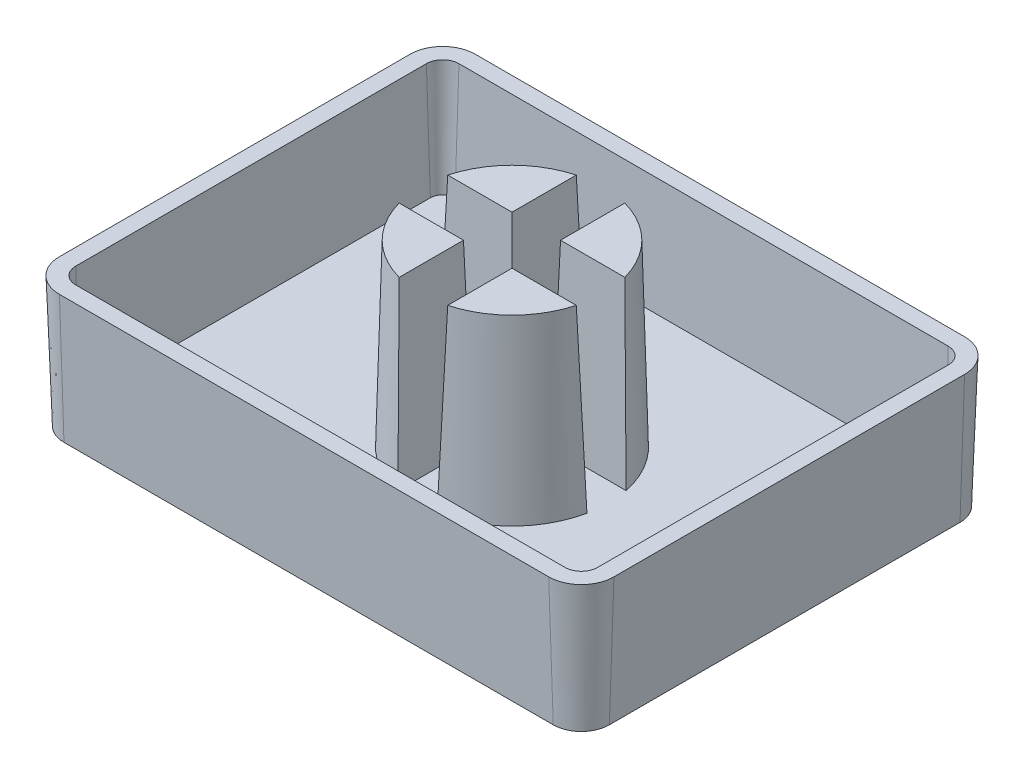
ISO-10303-21;
HEADER;
FILE_DESCRIPTION(('STEP AP214'),'2;1');
FILE_NAME('part.step','',(''),(''),'','','');
FILE_SCHEMA(('AUTOMOTIVE_DESIGN { 1 0 10303 214 1 1 1 1 }'));
ENDSEC;
DATA;
#1=APPLICATION_CONTEXT('core data for automotive mechanical design processes');
#2=APPLICATION_PROTOCOL_DEFINITION('international standard','automotive_design',2000,#1);
#3=PRODUCT_CONTEXT('',#1,'mechanical');
#4=PRODUCT('Part','Part','',(#3));
#5=PRODUCT_RELATED_PRODUCT_CATEGORY('part','',(#4));
#6=PRODUCT_DEFINITION_FORMATION('','',#4);
#7=PRODUCT_DEFINITION_CONTEXT('part definition',#1,'design');
#8=PRODUCT_DEFINITION('design','',#6,#7);
#9=PRODUCT_DEFINITION_SHAPE('','',#8);
#10=(LENGTH_UNIT() NAMED_UNIT(*) SI_UNIT(.MILLI.,.METRE.));
#11=(NAMED_UNIT(*) PLANE_ANGLE_UNIT() SI_UNIT($,.RADIAN.));
#12=(NAMED_UNIT(*) SI_UNIT($,.STERADIAN.) SOLID_ANGLE_UNIT());
#13=UNCERTAINTY_MEASURE_WITH_UNIT(LENGTH_MEASURE(1.E-05),#10,'distance_accuracy_value','');
#14=(GEOMETRIC_REPRESENTATION_CONTEXT(3) GLOBAL_UNCERTAINTY_ASSIGNED_CONTEXT((#13)) GLOBAL_UNIT_ASSIGNED_CONTEXT((#10,
#11,#12)) REPRESENTATION_CONTEXT('',''));
#15=CARTESIAN_POINT('',(0.,0.,0.));
#16=DIRECTION('',(0.,0.,1.));
#17=DIRECTION('',(1.,0.,0.));
#18=AXIS2_PLACEMENT_3D('',#15,#16,#17);
#19=CARTESIAN_POINT('',(-7.5,-3.5,-5.375));
#20=DIRECTION('',(0.,-1.,0.));
#21=DIRECTION('',(0.,0.,-1.));
#22=AXIS2_PLACEMENT_3D('',#19,#20,#21);
#23=PLANE('',#22);
#24=CARTESIAN_POINT('',(0.,-3.5,0.));
#25=DIRECTION('',(0.,1.,0.));
#26=DIRECTION('',(0.,0.,1.));
#27=AXIS2_PLACEMENT_3D('',#24,#25,#26);
#28=CIRCLE('',#27,2.9591708679417);
#29=CARTESIAN_POINT('',(2.8977046477643,-3.5,-0.6));
#30=VERTEX_POINT('',#29);
#31=CARTESIAN_POINT('',(0.599999999999999,-3.5,-2.89770464776431));
#32=VERTEX_POINT('',#31);
#33=EDGE_CURVE('E633',#30,#32,#28,.T.);
#34=ORIENTED_EDGE('',*,*,#33,.F.);
#35=DIRECTION('',(1.,0.,0.));
#36=VECTOR('',#35,1.);
#37=CARTESIAN_POINT('',(0.6,-3.5,-0.6));
#38=LINE('',#37,#36);
#39=CARTESIAN_POINT('',(0.6,-3.5,-0.6));
#40=VERTEX_POINT('',#39);
#41=EDGE_CURVE('E287',#40,#30,#38,.T.);
#42=ORIENTED_EDGE('',*,*,#41,.F.);
#43=DIRECTION('',(0.,0.,1.));
#44=VECTOR('',#43,1.);
#45=CARTESIAN_POINT('',(0.599999999999999,-3.5,-2.89770464776431));
#46=LINE('',#45,#44);
#47=EDGE_CURVE('E629',#32,#40,#46,.T.);
#48=ORIENTED_EDGE('',*,*,#47,.F.);
#49=EDGE_LOOP('',(#34,#42,#48));
#50=FACE_BOUND('',#49,.T.);
#51=CARTESIAN_POINT('',(-7.5,-3.5,-5.375));
#52=DIRECTION('',(0.,-1.,0.));
#53=DIRECTION('',(0.,0.,-1.));
#54=AXIS2_PLACEMENT_3D('',#51,#52,#53);
#55=CIRCLE('',#54,0.377472534629472);
#56=CARTESIAN_POINT('',(-7.5,-3.5,-5.75247253462947));
#57=VERTEX_POINT('',#56);
#58=CARTESIAN_POINT('',(-7.87747253462947,-3.5,-5.375));
#59=VERTEX_POINT('',#58);
#60=EDGE_CURVE('E532',#57,#59,#55,.F.);
#61=ORIENTED_EDGE('',*,*,#60,.T.);
#62=DIRECTION('',(0.,0.,1.));
#63=VECTOR('',#62,1.);
#64=CARTESIAN_POINT('',(-7.87747253462947,-3.5,5.37499999999999));
#65=LINE('',#64,#63);
#66=CARTESIAN_POINT('',(-7.87747253462947,-3.5,5.37499999999999));
#67=VERTEX_POINT('',#66);
#68=EDGE_CURVE('E553',#59,#67,#65,.T.);
#69=ORIENTED_EDGE('',*,*,#68,.T.);
#70=CARTESIAN_POINT('',(-7.5,-3.5,5.375));
#71=DIRECTION('',(0.,-1.,0.));
#72=DIRECTION('',(0.,0.,-1.));
#73=AXIS2_PLACEMENT_3D('',#70,#71,#72);
#74=CIRCLE('',#73,0.377472534629472);
#75=CARTESIAN_POINT('',(-7.5,-3.5,5.75247253462947));
#76=VERTEX_POINT('',#75);
#77=EDGE_CURVE('E556',#67,#76,#74,.F.);
#78=ORIENTED_EDGE('',*,*,#77,.T.);
#79=DIRECTION('',(1.,0.,0.));
#80=VECTOR('',#79,1.);
#81=CARTESIAN_POINT('',(-7.5,-3.5,5.75247253462947));
#82=LINE('',#81,#80);
#83=CARTESIAN_POINT('',(7.49999999999999,-3.5,5.75247253462947));
#84=VERTEX_POINT('',#83);
#85=EDGE_CURVE('E559',#76,#84,#82,.T.);
#86=ORIENTED_EDGE('',*,*,#85,.T.);
#87=CARTESIAN_POINT('',(7.5,-3.5,5.375));
#88=DIRECTION('',(0.,-1.,0.));
#89=DIRECTION('',(0.,0.,-1.));
#90=AXIS2_PLACEMENT_3D('',#87,#88,#89);
#91=CIRCLE('',#90,0.377472534629472);
#92=CARTESIAN_POINT('',(7.87747253462947,-3.5,5.375));
#93=VERTEX_POINT('',#92);
#94=EDGE_CURVE('E566',#84,#93,#91,.F.);
#95=ORIENTED_EDGE('',*,*,#94,.T.);
#96=DIRECTION('',(0.,0.,-1.));
#97=VECTOR('',#96,1.);
#98=CARTESIAN_POINT('',(7.87747253462947,-3.5,5.37499999999999));
#99=LINE('',#98,#97);
#100=CARTESIAN_POINT('',(7.87747253462947,-3.5,-5.37499999999999));
#101=VERTEX_POINT('',#100);
#102=EDGE_CURVE('E571',#93,#101,#99,.T.);
#103=ORIENTED_EDGE('',*,*,#102,.T.);
#104=CARTESIAN_POINT('',(7.5,-3.5,-5.375));
#105=DIRECTION('',(0.,-1.,0.));
#106=DIRECTION('',(0.,0.,-1.));
#107=AXIS2_PLACEMENT_3D('',#104,#105,#106);
#108=CIRCLE('',#107,0.377472534629472);
#109=CARTESIAN_POINT('',(7.5,-3.5,-5.75247253462947));
#110=VERTEX_POINT('',#109);
#111=EDGE_CURVE('E576',#101,#110,#108,.F.);
#112=ORIENTED_EDGE('',*,*,#111,.T.);
#113=DIRECTION('',(-1.,0.,0.));
#114=VECTOR('',#113,1.);
#115=CARTESIAN_POINT('',(-7.5,-3.5,-5.75247253462947));
#116=LINE('',#115,#114);
#117=EDGE_CURVE('E581',#110,#57,#116,.T.);
#118=ORIENTED_EDGE('',*,*,#117,.T.);
#119=EDGE_LOOP('',(#61,#69,#78,#86,#95,#103,#112,#118));
#120=FACE_BOUND('',#119,.T.);
#121=DIRECTION('',(1.,0.,0.));
#122=VECTOR('',#121,1.);
#123=CARTESIAN_POINT('',(-2.8977046477643,-3.5,-0.6));
#124=LINE('',#123,#122);
#125=CARTESIAN_POINT('',(-2.8977046477643,-3.5,-0.600000000000001));
#126=VERTEX_POINT('',#125);
#127=CARTESIAN_POINT('',(-0.599999999999998,-3.5,-0.6));
#128=VERTEX_POINT('',#127);
#129=EDGE_CURVE('E324',#126,#128,#124,.T.);
#130=ORIENTED_EDGE('',*,*,#129,.F.);
#131=CARTESIAN_POINT('',(0.,-3.5,0.));
#132=DIRECTION('',(0.,1.,0.));
#133=DIRECTION('',(0.,0.,1.));
#134=AXIS2_PLACEMENT_3D('',#131,#132,#133);
#135=CIRCLE('',#134,2.9591708679417);
#136=CARTESIAN_POINT('',(-0.599999999999999,-3.5,-2.89770464776431));
#137=VERTEX_POINT('',#136);
#138=EDGE_CURVE('E595',#137,#126,#135,.T.);
#139=ORIENTED_EDGE('',*,*,#138,.F.);
#140=DIRECTION('',(0.,0.,-1.));
#141=VECTOR('',#140,1.);
#142=CARTESIAN_POINT('',(-0.599999999999999,-3.5,-2.89770464776431));
#143=LINE('',#142,#141);
#144=EDGE_CURVE('E599',#128,#137,#143,.T.);
#145=ORIENTED_EDGE('',*,*,#144,.F.);
#146=EDGE_LOOP('',(#130,#139,#145));
#147=FACE_BOUND('',#146,.T.);
#148=CARTESIAN_POINT('',(0.,-3.5,0.));
#149=DIRECTION('',(0.,1.,0.));
#150=DIRECTION('',(0.,0.,1.));
#151=AXIS2_PLACEMENT_3D('',#148,#149,#150);
#152=CIRCLE('',#151,2.9591708679417);
#153=CARTESIAN_POINT('',(-2.8977046477643,-3.5,0.6));
#154=VERTEX_POINT('',#153);
#155=CARTESIAN_POINT('',(-0.599999999999999,-3.5,2.89770464776431));
#156=VERTEX_POINT('',#155);
#157=EDGE_CURVE('E285',#154,#156,#152,.T.);
#158=ORIENTED_EDGE('',*,*,#157,.F.);
#159=DIRECTION('',(-1.,0.,0.));
#160=VECTOR('',#159,1.);
#161=CARTESIAN_POINT('',(-2.8977046477643,-3.5,0.6));
#162=LINE('',#161,#160);
#163=CARTESIAN_POINT('',(-0.599999999999999,-3.5,0.599999999999999));
#164=VERTEX_POINT('',#163);
#165=EDGE_CURVE('E326',#164,#154,#162,.T.);
#166=ORIENTED_EDGE('',*,*,#165,.F.);
#167=DIRECTION('',(0.,0.,-1.));
#168=VECTOR('',#167,1.);
#169=CARTESIAN_POINT('',(-0.599999999999999,-3.5,0.599999999999999));
#170=LINE('',#169,#168);
#171=EDGE_CURVE('E614',#156,#164,#170,.T.);
#172=ORIENTED_EDGE('',*,*,#171,.F.);
#173=EDGE_LOOP('',(#158,#166,#172));
#174=FACE_BOUND('',#173,.T.);
#175=CARTESIAN_POINT('',(0.,-3.5,0.));
#176=DIRECTION('',(0.,1.,0.));
#177=DIRECTION('',(0.,0.,1.));
#178=AXIS2_PLACEMENT_3D('',#175,#176,#177);
#179=CIRCLE('',#178,2.9591708679417);
#180=CARTESIAN_POINT('',(0.599999999999999,-3.5,2.89770464776431));
#181=VERTEX_POINT('',#180);
#182=CARTESIAN_POINT('',(2.89770464776431,-3.5,0.600000000000001));
#183=VERTEX_POINT('',#182);
#184=EDGE_CURVE('E220',#181,#183,#179,.T.);
#185=ORIENTED_EDGE('',*,*,#184,.F.);
#186=DIRECTION('',(0.,0.,1.));
#187=VECTOR('',#186,1.);
#188=CARTESIAN_POINT('',(0.6,-3.5,0.599999999999999));
#189=LINE('',#188,#187);
#190=CARTESIAN_POINT('',(0.599999999999998,-3.5,0.599999999999999));
#191=VERTEX_POINT('',#190);
#192=EDGE_CURVE('E59',#191,#181,#189,.T.);
#193=ORIENTED_EDGE('',*,*,#192,.F.);
#194=DIRECTION('',(-1.,0.,0.));
#195=VECTOR('',#194,1.);
#196=CARTESIAN_POINT('',(0.6,-3.5,0.599999999999999));
#197=LINE('',#196,#195);
#198=EDGE_CURVE('E55',#183,#191,#197,.T.);
#199=ORIENTED_EDGE('',*,*,#198,.F.);
#200=EDGE_LOOP('',(#185,#193,#199));
#201=FACE_BOUND('',#200,.T.);
#202=ADVANCED_FACE('F38',(#50,#120,#147,#174,#201),#23,.F.);
#203=CARTESIAN_POINT('',(-7.5,0.,-5.375));
#204=DIRECTION('',(0.,-1.,0.));
#205=DIRECTION('',(0.,0.,-1.));
#206=AXIS2_PLACEMENT_3D('',#203,#204,#205);
#207=PLANE('',#206);
#208=CARTESIAN_POINT('',(-7.5,0.,-5.375));
#209=DIRECTION('',(0.,1.,0.));
#210=DIRECTION('',(0.,0.,-1.));
#211=AXIS2_PLACEMENT_3D('',#208,#209,#210);
#212=CIRCLE('',#211,1.);
#213=CARTESIAN_POINT('',(-7.5,0.,-6.375));
#214=VERTEX_POINT('',#213);
#215=CARTESIAN_POINT('',(-8.5,0.,-5.37499999999999));
#216=VERTEX_POINT('',#215);
#217=EDGE_CURVE('E516',#214,#216,#212,.T.);
#218=ORIENTED_EDGE('',*,*,#217,.T.);
#219=DIRECTION('',(0.,0.,1.));
#220=VECTOR('',#219,1.);
#221=CARTESIAN_POINT('',(-8.5,0.,5.37499999999999));
#222=LINE('',#221,#220);
#223=CARTESIAN_POINT('',(-8.5,0.,5.37499999999999));
#224=VERTEX_POINT('',#223);
#225=EDGE_CURVE('E523',#216,#224,#222,.T.);
#226=ORIENTED_EDGE('',*,*,#225,.T.);
#227=CARTESIAN_POINT('',(-7.5,0.,5.375));
#228=DIRECTION('',(0.,1.,0.));
#229=DIRECTION('',(0.,0.,-1.));
#230=AXIS2_PLACEMENT_3D('',#227,#228,#229);
#231=CIRCLE('',#230,1.);
#232=CARTESIAN_POINT('',(-7.5,0.,6.375));
#233=VERTEX_POINT('',#232);
#234=EDGE_CURVE('E521',#224,#233,#231,.T.);
#235=ORIENTED_EDGE('',*,*,#234,.T.);
#236=DIRECTION('',(1.,0.,0.));
#237=VECTOR('',#236,1.);
#238=CARTESIAN_POINT('',(-7.5,0.,6.375));
#239=LINE('',#238,#237);
#240=CARTESIAN_POINT('',(7.49999999999999,0.,6.375));
#241=VERTEX_POINT('',#240);
#242=EDGE_CURVE('E472',#233,#241,#239,.T.);
#243=ORIENTED_EDGE('',*,*,#242,.T.);
#244=CARTESIAN_POINT('',(7.5,0.,5.375));
#245=DIRECTION('',(0.,1.,0.));
#246=DIRECTION('',(0.,0.,-1.));
#247=AXIS2_PLACEMENT_3D('',#244,#245,#246);
#248=CIRCLE('',#247,1.);
#249=CARTESIAN_POINT('',(8.5,0.,5.37499999999999));
#250=VERTEX_POINT('',#249);
#251=EDGE_CURVE('E470',#241,#250,#248,.T.);
#252=ORIENTED_EDGE('',*,*,#251,.T.);
#253=DIRECTION('',(0.,0.,-1.));
#254=VECTOR('',#253,1.);
#255=CARTESIAN_POINT('',(8.5,0.,5.37499999999999));
#256=LINE('',#255,#254);
#257=CARTESIAN_POINT('',(8.5,0.,-5.37499999999999));
#258=VERTEX_POINT('',#257);
#259=EDGE_CURVE('E462',#250,#258,#256,.T.);
#260=ORIENTED_EDGE('',*,*,#259,.T.);
#261=CARTESIAN_POINT('',(7.5,0.,-5.375));
#262=DIRECTION('',(0.,1.,0.));
#263=DIRECTION('',(0.,0.,1.));
#264=AXIS2_PLACEMENT_3D('',#261,#262,#263);
#265=CIRCLE('',#264,1.);
#266=CARTESIAN_POINT('',(7.49999999999999,0.,-6.375));
#267=VERTEX_POINT('',#266);
#268=EDGE_CURVE('E454',#258,#267,#265,.T.);
#269=ORIENTED_EDGE('',*,*,#268,.T.);
#270=DIRECTION('',(-1.,0.,0.));
#271=VECTOR('',#270,1.);
#272=CARTESIAN_POINT('',(-7.5,0.,-6.375));
#273=LINE('',#272,#271);
#274=EDGE_CURVE('E461',#267,#214,#273,.T.);
#275=ORIENTED_EDGE('',*,*,#274,.T.);
#276=EDGE_LOOP('',(#218,#226,#235,#243,#252,#260,#269,#275));
#277=FACE_BOUND('',#276,.T.);
#278=CARTESIAN_POINT('',(-7.5,0.,-5.375));
#279=DIRECTION('',(0.,-1.,0.));
#280=DIRECTION('',(0.,0.,-1.));
#281=AXIS2_PLACEMENT_3D('',#278,#279,#280);
#282=CIRCLE('',#281,0.499695227850589);
#283=CARTESIAN_POINT('',(-7.5,0.,-5.87469522785059));
#284=VERTEX_POINT('',#283);
#285=CARTESIAN_POINT('',(-7.99969522785059,0.,-5.375));
#286=VERTEX_POINT('',#285);
#287=EDGE_CURVE('E550',#284,#286,#282,.F.);
#288=ORIENTED_EDGE('',*,*,#287,.F.);
#289=DIRECTION('',(-1.,0.,0.));
#290=VECTOR('',#289,1.);
#291=CARTESIAN_POINT('',(-7.5,0.,-5.87469522785059));
#292=LINE('',#291,#290);
#293=CARTESIAN_POINT('',(7.5,0.,-5.87469522785059));
#294=VERTEX_POINT('',#293);
#295=EDGE_CURVE('E529',#294,#284,#292,.T.);
#296=ORIENTED_EDGE('',*,*,#295,.F.);
#297=CARTESIAN_POINT('',(7.5,0.,-5.375));
#298=DIRECTION('',(0.,-1.,0.));
#299=DIRECTION('',(0.,0.,-1.));
#300=AXIS2_PLACEMENT_3D('',#297,#298,#299);
#301=CIRCLE('',#300,0.499695227850589);
#302=CARTESIAN_POINT('',(7.99969522785059,0.,-5.37499999999999));
#303=VERTEX_POINT('',#302);
#304=EDGE_CURVE('E533',#303,#294,#301,.F.);
#305=ORIENTED_EDGE('',*,*,#304,.F.);
#306=DIRECTION('',(0.,0.,-1.));
#307=VECTOR('',#306,1.);
#308=CARTESIAN_POINT('',(7.99969522785059,0.,5.37499999999999));
#309=LINE('',#308,#307);
#310=CARTESIAN_POINT('',(7.99969522785059,0.,5.375));
#311=VERTEX_POINT('',#310);
#312=EDGE_CURVE('E535',#311,#303,#309,.T.);
#313=ORIENTED_EDGE('',*,*,#312,.F.);
#314=CARTESIAN_POINT('',(7.5,0.,5.375));
#315=DIRECTION('',(0.,-1.,0.));
#316=DIRECTION('',(0.,0.,-1.));
#317=AXIS2_PLACEMENT_3D('',#314,#315,#316);
#318=CIRCLE('',#317,0.499695227850589);
#319=CARTESIAN_POINT('',(7.49999999999999,0.,5.87469522785059));
#320=VERTEX_POINT('',#319);
#321=EDGE_CURVE('E538',#320,#311,#318,.F.);
#322=ORIENTED_EDGE('',*,*,#321,.F.);
#323=DIRECTION('',(1.,0.,0.));
#324=VECTOR('',#323,1.);
#325=CARTESIAN_POINT('',(-7.5,0.,5.87469522785059));
#326=LINE('',#325,#324);
#327=CARTESIAN_POINT('',(-7.5,0.,5.87469522785059));
#328=VERTEX_POINT('',#327);
#329=EDGE_CURVE('E541',#328,#320,#326,.T.);
#330=ORIENTED_EDGE('',*,*,#329,.F.);
#331=CARTESIAN_POINT('',(-7.5,0.,5.375));
#332=DIRECTION('',(0.,-1.,0.));
#333=DIRECTION('',(0.,0.,-1.));
#334=AXIS2_PLACEMENT_3D('',#331,#332,#333);
#335=CIRCLE('',#334,0.499695227850589);
#336=CARTESIAN_POINT('',(-7.99969522785059,0.,5.37499999999999));
#337=VERTEX_POINT('',#336);
#338=EDGE_CURVE('E544',#337,#328,#335,.F.);
#339=ORIENTED_EDGE('',*,*,#338,.F.);
#340=DIRECTION('',(0.,0.,1.));
#341=VECTOR('',#340,1.);
#342=CARTESIAN_POINT('',(-7.99969522785059,0.,5.37499999999999));
#343=LINE('',#342,#341);
#344=EDGE_CURVE('E547',#286,#337,#343,.T.);
#345=ORIENTED_EDGE('',*,*,#344,.F.);
#346=EDGE_LOOP('',(#288,#296,#305,#313,#322,#330,#339,#345));
#347=FACE_BOUND('',#346,.T.);
#348=ADVANCED_FACE('F414',(#277,#347),#207,.F.);
#349=CARTESIAN_POINT('',(-7.5,0.,-5.375));
#350=DIRECTION('',(0.,1.,0.));
#351=DIRECTION('',(0.,0.,-1.));
#352=AXIS2_PLACEMENT_3D('',#349,#350,#351);
#353=CONICAL_SURFACE('',#352,1.,0.0349065850398867);
#354=ORIENTED_EDGE('',*,*,#217,.F.);
#355=DIRECTION('',(0.,0.999390827019096,-0.034899496702501));
#356=VECTOR('',#355,1.);
#357=CARTESIAN_POINT('',(-7.5,0.,-6.375));
#358=LINE('',#357,#356);
#359=CARTESIAN_POINT('',(-7.5,-4.,-6.23531692203301));
#360=VERTEX_POINT('',#359);
#361=EDGE_CURVE('E11',#360,#214,#358,.T.);
#362=ORIENTED_EDGE('',*,*,#361,.F.);
#363=CARTESIAN_POINT('',(-7.5,-4.,-5.375));
#364=DIRECTION('',(0.,-1.,0.));
#365=DIRECTION('',(0.,0.,-1.));
#366=AXIS2_PLACEMENT_3D('',#363,#364,#365);
#367=CIRCLE('',#366,0.860316922033009);
#368=CARTESIAN_POINT('',(-8.36031692203301,-4.,-5.37499999999999));
#369=VERTEX_POINT('',#368);
#370=EDGE_CURVE('E476',#360,#369,#367,.F.);
#371=ORIENTED_EDGE('',*,*,#370,.T.);
#372=DIRECTION('',(-0.034899496702501,0.999390827019096,0.));
#373=VECTOR('',#372,1.);
#374=CARTESIAN_POINT('',(-8.5,0.,-5.37499999999999));
#375=LINE('',#374,#373);
#376=EDGE_CURVE('E478',#369,#216,#375,.T.);
#377=ORIENTED_EDGE('',*,*,#376,.T.);
#378=EDGE_LOOP('',(#354,#362,#371,#377));
#379=FACE_BOUND('',#378,.T.);
#380=ADVANCED_FACE('F422',(#379),#353,.T.);
#381=CARTESIAN_POINT('',(-7.5,0.,-6.375));
#382=DIRECTION('',(0.,-0.034899496702501,-0.999390827019096));
#383=DIRECTION('',(0.,0.999390827019096,-0.034899496702501));
#384=AXIS2_PLACEMENT_3D('',#381,#382,#383);
#385=PLANE('',#384);
#386=ORIENTED_EDGE('',*,*,#274,.F.);
#387=DIRECTION('',(0.,0.999390827019096,-0.034899496702501));
#388=VECTOR('',#387,1.);
#389=CARTESIAN_POINT('',(7.49999999999999,0.,-6.375));
#390=LINE('',#389,#388);
#391=CARTESIAN_POINT('',(7.49999999999999,-4.,-6.23531692203301));
#392=VERTEX_POINT('',#391);
#393=EDGE_CURVE('E47',#392,#267,#390,.T.);
#394=ORIENTED_EDGE('',*,*,#393,.F.);
#395=DIRECTION('',(-1.,0.,0.));
#396=VECTOR('',#395,1.);
#397=CARTESIAN_POINT('',(-7.5,-4.,-6.23531692203301));
#398=LINE('',#397,#396);
#399=EDGE_CURVE('E481',#392,#360,#398,.T.);
#400=ORIENTED_EDGE('',*,*,#399,.T.);
#401=ORIENTED_EDGE('',*,*,#361,.T.);
#402=EDGE_LOOP('',(#386,#394,#400,#401));
#403=FACE_BOUND('',#402,.T.);
#404=ADVANCED_FACE('F40',(#403),#385,.T.);
#405=CARTESIAN_POINT('',(7.5,0.,-5.375));
#406=DIRECTION('',(0.,1.,0.));
#407=DIRECTION('',(0.,0.,1.));
#408=AXIS2_PLACEMENT_3D('',#405,#406,#407);
#409=CONICAL_SURFACE('',#408,1.,0.0349065850398867);
#410=ORIENTED_EDGE('',*,*,#268,.F.);
#411=DIRECTION('',(0.034899496702501,0.999390827019096,0.));
#412=VECTOR('',#411,1.);
#413=CARTESIAN_POINT('',(8.5,0.,-5.37499999999999));
#414=LINE('',#413,#412);
#415=CARTESIAN_POINT('',(8.36031692203301,-4.,-5.37499999999999));
#416=VERTEX_POINT('',#415);
#417=EDGE_CURVE('E457',#416,#258,#414,.T.);
#418=ORIENTED_EDGE('',*,*,#417,.F.);
#419=CARTESIAN_POINT('',(7.5,-4.,-5.375));
#420=DIRECTION('',(0.,-1.,0.));
#421=DIRECTION('',(0.,0.,-1.));
#422=AXIS2_PLACEMENT_3D('',#419,#420,#421);
#423=CIRCLE('',#422,0.860316922033009);
#424=EDGE_CURVE('E495',#416,#392,#423,.F.);
#425=ORIENTED_EDGE('',*,*,#424,.T.);
#426=ORIENTED_EDGE('',*,*,#393,.T.);
#427=EDGE_LOOP('',(#410,#418,#425,#426));
#428=FACE_BOUND('',#427,.T.);
#429=ADVANCED_FACE('F444',(#428),#409,.T.);
#430=CARTESIAN_POINT('',(8.5,0.,5.37499999999999));
#431=DIRECTION('',(0.999390827019096,-0.034899496702501,0.));
#432=DIRECTION('',(0.034899496702501,0.999390827019096,0.));
#433=AXIS2_PLACEMENT_3D('',#430,#431,#432);
#434=PLANE('',#433);
#435=ORIENTED_EDGE('',*,*,#259,.F.);
#436=DIRECTION('',(0.034899496702501,0.999390827019096,0.));
#437=VECTOR('',#436,1.);
#438=CARTESIAN_POINT('',(8.5,0.,5.37499999999999));
#439=LINE('',#438,#437);
#440=CARTESIAN_POINT('',(8.36031692203301,-4.,5.37499999999999));
#441=VERTEX_POINT('',#440);
#442=EDGE_CURVE('E487',#441,#250,#439,.T.);
#443=ORIENTED_EDGE('',*,*,#442,.F.);
#444=DIRECTION('',(0.,0.,-1.));
#445=VECTOR('',#444,1.);
#446=CARTESIAN_POINT('',(8.36031692203301,-4.,5.37499999999999));
#447=LINE('',#446,#445);
#448=EDGE_CURVE('E497',#441,#416,#447,.T.);
#449=ORIENTED_EDGE('',*,*,#448,.T.);
#450=ORIENTED_EDGE('',*,*,#417,.T.);
#451=EDGE_LOOP('',(#435,#443,#449,#450));
#452=FACE_BOUND('',#451,.T.);
#453=ADVANCED_FACE('F441',(#452),#434,.T.);
#454=CARTESIAN_POINT('',(7.5,0.,5.375));
#455=DIRECTION('',(0.,1.,0.));
#456=DIRECTION('',(0.,0.,-1.));
#457=AXIS2_PLACEMENT_3D('',#454,#455,#456);
#458=CONICAL_SURFACE('',#457,1.,0.0349065850398867);
#459=ORIENTED_EDGE('',*,*,#251,.F.);
#460=DIRECTION('',(0.,0.999390827019096,0.034899496702501));
#461=VECTOR('',#460,1.);
#462=CARTESIAN_POINT('',(7.49999999999999,0.,6.375));
#463=LINE('',#462,#461);
#464=CARTESIAN_POINT('',(7.49999999999999,-4.,6.23531692203301));
#465=VERTEX_POINT('',#464);
#466=EDGE_CURVE('E485',#465,#241,#463,.T.);
#467=ORIENTED_EDGE('',*,*,#466,.F.);
#468=CARTESIAN_POINT('',(7.5,-4.,5.375));
#469=DIRECTION('',(0.,-1.,0.));
#470=DIRECTION('',(0.,0.,-1.));
#471=AXIS2_PLACEMENT_3D('',#468,#469,#470);
#472=CIRCLE('',#471,0.860316922033009);
#473=EDGE_CURVE('E500',#465,#441,#472,.F.);
#474=ORIENTED_EDGE('',*,*,#473,.T.);
#475=ORIENTED_EDGE('',*,*,#442,.T.);
#476=EDGE_LOOP('',(#459,#467,#474,#475));
#477=FACE_BOUND('',#476,.T.);
#478=ADVANCED_FACE('F437',(#477),#458,.T.);
#479=CARTESIAN_POINT('',(-7.5,0.,6.375));
#480=DIRECTION('',(0.,-0.034899496702501,0.999390827019096));
#481=DIRECTION('',(0.,-0.999390827019096,-0.034899496702501));
#482=AXIS2_PLACEMENT_3D('',#479,#480,#481);
#483=PLANE('',#482);
#484=ORIENTED_EDGE('',*,*,#242,.F.);
#485=DIRECTION('',(0.,0.999390827019096,0.034899496702501));
#486=VECTOR('',#485,1.);
#487=CARTESIAN_POINT('',(-7.5,0.,6.375));
#488=LINE('',#487,#486);
#489=CARTESIAN_POINT('',(-7.5,-4.,6.23531692203301));
#490=VERTEX_POINT('',#489);
#491=EDGE_CURVE('E483',#490,#233,#488,.T.);
#492=ORIENTED_EDGE('',*,*,#491,.F.);
#493=DIRECTION('',(1.,0.,0.));
#494=VECTOR('',#493,1.);
#495=CARTESIAN_POINT('',(-7.5,-4.,6.23531692203301));
#496=LINE('',#495,#494);
#497=EDGE_CURVE('E503',#490,#465,#496,.T.);
#498=ORIENTED_EDGE('',*,*,#497,.T.);
#499=ORIENTED_EDGE('',*,*,#466,.T.);
#500=EDGE_LOOP('',(#484,#492,#498,#499));
#501=FACE_BOUND('',#500,.T.);
#502=ADVANCED_FACE('F433',(#501),#483,.T.);
#503=CARTESIAN_POINT('',(-7.5,0.,5.375));
#504=DIRECTION('',(0.,1.,0.));
#505=DIRECTION('',(0.,0.,-1.));
#506=AXIS2_PLACEMENT_3D('',#503,#504,#505);
#507=CONICAL_SURFACE('',#506,1.,0.0349065850398867);
#508=ORIENTED_EDGE('',*,*,#234,.F.);
#509=DIRECTION('',(-0.034899496702501,0.999390827019096,0.));
#510=VECTOR('',#509,1.);
#511=CARTESIAN_POINT('',(-8.5,0.,5.37499999999999));
#512=LINE('',#511,#510);
#513=CARTESIAN_POINT('',(-8.36031692203301,-4.,5.37499999999999));
#514=VERTEX_POINT('',#513);
#515=EDGE_CURVE('E480',#514,#224,#512,.T.);
#516=ORIENTED_EDGE('',*,*,#515,.F.);
#517=CARTESIAN_POINT('',(-7.5,-4.,5.375));
#518=DIRECTION('',(0.,-1.,0.));
#519=DIRECTION('',(0.,0.,-1.));
#520=AXIS2_PLACEMENT_3D('',#517,#518,#519);
#521=CIRCLE('',#520,0.860316922033009);
#522=EDGE_CURVE('E505',#514,#490,#521,.F.);
#523=ORIENTED_EDGE('',*,*,#522,.T.);
#524=ORIENTED_EDGE('',*,*,#491,.T.);
#525=EDGE_LOOP('',(#508,#516,#523,#524));
#526=FACE_BOUND('',#525,.T.);
#527=ADVANCED_FACE('F429',(#526),#507,.T.);
#528=CARTESIAN_POINT('',(-8.5,0.,5.37499999999999));
#529=DIRECTION('',(-0.999390827019096,-0.034899496702501,0.));
#530=DIRECTION('',(0.034899496702501,-0.999390827019096,0.));
#531=AXIS2_PLACEMENT_3D('',#528,#529,#530);
#532=PLANE('',#531);
#533=ORIENTED_EDGE('',*,*,#225,.F.);
#534=ORIENTED_EDGE('',*,*,#376,.F.);
#535=DIRECTION('',(0.,0.,1.));
#536=VECTOR('',#535,1.);
#537=CARTESIAN_POINT('',(-8.36031692203301,-4.,5.37499999999999));
#538=LINE('',#537,#536);
#539=EDGE_CURVE('E42',#369,#514,#538,.T.);
#540=ORIENTED_EDGE('',*,*,#539,.T.);
#541=ORIENTED_EDGE('',*,*,#515,.T.);
#542=EDGE_LOOP('',(#533,#534,#540,#541));
#543=FACE_BOUND('',#542,.T.);
#544=ADVANCED_FACE('F418',(#543),#532,.T.);
#545=CARTESIAN_POINT('',(-7.5,-4.,-5.375));
#546=DIRECTION('',(0.,-1.,0.));
#547=DIRECTION('',(0.,0.,-1.));
#548=AXIS2_PLACEMENT_3D('',#545,#546,#547);
#549=PLANE('',#548);
#550=ORIENTED_EDGE('',*,*,#370,.F.);
#551=ORIENTED_EDGE('',*,*,#399,.F.);
#552=ORIENTED_EDGE('',*,*,#424,.F.);
#553=ORIENTED_EDGE('',*,*,#448,.F.);
#554=ORIENTED_EDGE('',*,*,#473,.F.);
#555=ORIENTED_EDGE('',*,*,#497,.F.);
#556=ORIENTED_EDGE('',*,*,#522,.F.);
#557=ORIENTED_EDGE('',*,*,#539,.F.);
#558=EDGE_LOOP('',(#550,#551,#552,#553,#554,#555,#556,#557));
#559=FACE_BOUND('',#558,.T.);
#560=ADVANCED_FACE('F384',(#559),#549,.T.);
#561=CARTESIAN_POINT('',(-7.5,0.0174497483512505,-5.375));
#562=DIRECTION('',(0.,1.,0.));
#563=DIRECTION('',(0.,0.,-1.));
#564=AXIS2_PLACEMENT_3D('',#561,#562,#563);
#565=CONICAL_SURFACE('',#564,0.500304586490452,0.0349065850398867);
#566=ORIENTED_EDGE('',*,*,#287,.T.);
#567=DIRECTION('',(-0.034899496702501,0.999390827019096,0.));
#568=VECTOR('',#567,1.);
#569=CARTESIAN_POINT('',(-8.00030458649045,0.0174497483512505,-5.375));
#570=LINE('',#569,#568);
#571=EDGE_CURVE('E563',#59,#286,#570,.T.);
#572=ORIENTED_EDGE('',*,*,#571,.F.);
#573=ORIENTED_EDGE('',*,*,#60,.F.);
#574=DIRECTION('',(0.,0.999390827019096,-0.034899496702501));
#575=VECTOR('',#574,1.);
#576=CARTESIAN_POINT('',(-7.5,0.0174497483512505,-5.87530458649045));
#577=LINE('',#576,#575);
#578=EDGE_CURVE('E526',#57,#284,#577,.T.);
#579=ORIENTED_EDGE('',*,*,#578,.T.);
#580=EDGE_LOOP('',(#566,#572,#573,#579));
#581=FACE_BOUND('',#580,.T.);
#582=ADVANCED_FACE('F380',(#581),#565,.F.);
#583=CARTESIAN_POINT('',(-7.5,0.0174497483512505,-5.87530458649045));
#584=DIRECTION('',(0.,-0.034899496702501,-0.999390827019096));
#585=DIRECTION('',(0.,0.999390827019096,-0.034899496702501));
#586=AXIS2_PLACEMENT_3D('',#583,#584,#585);
#587=PLANE('',#586);
#588=ORIENTED_EDGE('',*,*,#295,.T.);
#589=ORIENTED_EDGE('',*,*,#578,.F.);
#590=ORIENTED_EDGE('',*,*,#117,.F.);
#591=DIRECTION('',(0.,0.999390827019096,-0.034899496702501));
#592=VECTOR('',#591,1.);
#593=CARTESIAN_POINT('',(7.5,0.0174497483512505,-5.87530458649045));
#594=LINE('',#593,#592);
#595=EDGE_CURVE('E583',#110,#294,#594,.T.);
#596=ORIENTED_EDGE('',*,*,#595,.T.);
#597=EDGE_LOOP('',(#588,#589,#590,#596));
#598=FACE_BOUND('',#597,.T.);
#599=ADVANCED_FACE('F383',(#598),#587,.F.);
#600=CARTESIAN_POINT('',(7.5,0.0174497483512505,-5.375));
#601=DIRECTION('',(0.,1.,0.));
#602=DIRECTION('',(0.,0.,1.));
#603=AXIS2_PLACEMENT_3D('',#600,#601,#602);
#604=CONICAL_SURFACE('',#603,0.500304586490452,0.0349065850398867);
#605=ORIENTED_EDGE('',*,*,#304,.T.);
#606=ORIENTED_EDGE('',*,*,#595,.F.);
#607=ORIENTED_EDGE('',*,*,#111,.F.);
#608=DIRECTION('',(0.034899496702501,0.999390827019096,0.));
#609=VECTOR('',#608,1.);
#610=CARTESIAN_POINT('',(8.00030458649045,0.0174497483512505,-5.37499999999999));
#611=LINE('',#610,#609);
#612=EDGE_CURVE('E578',#101,#303,#611,.T.);
#613=ORIENTED_EDGE('',*,*,#612,.T.);
#614=EDGE_LOOP('',(#605,#606,#607,#613));
#615=FACE_BOUND('',#614,.T.);
#616=ADVANCED_FACE('F388',(#615),#604,.F.);
#617=CARTESIAN_POINT('',(8.00030458649045,0.0174497483512505,5.37499999999999));
#618=DIRECTION('',(0.999390827019096,-0.034899496702501,0.));
#619=DIRECTION('',(0.034899496702501,0.999390827019096,0.));
#620=AXIS2_PLACEMENT_3D('',#617,#618,#619);
#621=PLANE('',#620);
#622=ORIENTED_EDGE('',*,*,#312,.T.);
#623=ORIENTED_EDGE('',*,*,#612,.F.);
#624=ORIENTED_EDGE('',*,*,#102,.F.);
#625=DIRECTION('',(0.034899496702501,0.999390827019096,0.));
#626=VECTOR('',#625,1.);
#627=CARTESIAN_POINT('',(8.00030458649045,0.0174497483512505,5.375));
#628=LINE('',#627,#626);
#629=EDGE_CURVE('E573',#93,#311,#628,.T.);
#630=ORIENTED_EDGE('',*,*,#629,.T.);
#631=EDGE_LOOP('',(#622,#623,#624,#630));
#632=FACE_BOUND('',#631,.T.);
#633=ADVANCED_FACE('F392',(#632),#621,.F.);
#634=CARTESIAN_POINT('',(7.5,0.0174497483512505,5.375));
#635=DIRECTION('',(0.,1.,0.));
#636=DIRECTION('',(0.,0.,-1.));
#637=AXIS2_PLACEMENT_3D('',#634,#635,#636);
#638=CONICAL_SURFACE('',#637,0.500304586490452,0.0349065850398867);
#639=ORIENTED_EDGE('',*,*,#321,.T.);
#640=ORIENTED_EDGE('',*,*,#629,.F.);
#641=ORIENTED_EDGE('',*,*,#94,.F.);
#642=DIRECTION('',(0.,-0.999390827019096,-0.034899496702501));
#643=VECTOR('',#642,1.);
#644=CARTESIAN_POINT('',(7.49999999999999,0.0174497483512505,5.87530458649045));
#645=LINE('',#644,#643);
#646=EDGE_CURVE('E568',#84,#320,#645,.F.);
#647=ORIENTED_EDGE('',*,*,#646,.T.);
#648=EDGE_LOOP('',(#639,#640,#641,#647));
#649=FACE_BOUND('',#648,.T.);
#650=ADVANCED_FACE('F396',(#649),#638,.F.);
#651=CARTESIAN_POINT('',(-7.5,0.0174497483512505,5.87530458649045));
#652=DIRECTION('',(0.,-0.034899496702501,0.999390827019096));
#653=DIRECTION('',(0.,-0.999390827019096,-0.034899496702501));
#654=AXIS2_PLACEMENT_3D('',#651,#652,#653);
#655=PLANE('',#654);
#656=ORIENTED_EDGE('',*,*,#329,.T.);
#657=ORIENTED_EDGE('',*,*,#646,.F.);
#658=ORIENTED_EDGE('',*,*,#85,.F.);
#659=DIRECTION('',(0.,0.999390827019096,0.034899496702501));
#660=VECTOR('',#659,1.);
#661=CARTESIAN_POINT('',(-7.5,0.0174497483512505,5.87530458649045));
#662=LINE('',#661,#660);
#663=EDGE_CURVE('E562',#76,#328,#662,.T.);
#664=ORIENTED_EDGE('',*,*,#663,.T.);
#665=EDGE_LOOP('',(#656,#657,#658,#664));
#666=FACE_BOUND('',#665,.T.);
#667=ADVANCED_FACE('F400',(#666),#655,.F.);
#668=CARTESIAN_POINT('',(-7.5,0.0174497483512505,5.375));
#669=DIRECTION('',(0.,1.,0.));
#670=DIRECTION('',(0.,0.,-1.));
#671=AXIS2_PLACEMENT_3D('',#668,#669,#670);
#672=CONICAL_SURFACE('',#671,0.500304586490452,0.0349065850398867);
#673=ORIENTED_EDGE('',*,*,#338,.T.);
#674=ORIENTED_EDGE('',*,*,#663,.F.);
#675=ORIENTED_EDGE('',*,*,#77,.F.);
#676=DIRECTION('',(0.034899496702501,-0.999390827019096,0.));
#677=VECTOR('',#676,1.);
#678=CARTESIAN_POINT('',(-8.00030458649045,0.0174497483512505,5.37499999999999));
#679=LINE('',#678,#677);
#680=EDGE_CURVE('E560',#67,#337,#679,.F.);
#681=ORIENTED_EDGE('',*,*,#680,.T.);
#682=EDGE_LOOP('',(#673,#674,#675,#681));
#683=FACE_BOUND('',#682,.T.);
#684=ADVANCED_FACE('F404',(#683),#672,.F.);
#685=CARTESIAN_POINT('',(-8.00030458649045,0.0174497483512505,5.37499999999999));
#686=DIRECTION('',(-0.999390827019096,-0.034899496702501,0.));
#687=DIRECTION('',(0.034899496702501,-0.999390827019096,0.));
#688=AXIS2_PLACEMENT_3D('',#685,#686,#687);
#689=PLANE('',#688);
#690=ORIENTED_EDGE('',*,*,#344,.T.);
#691=ORIENTED_EDGE('',*,*,#680,.F.);
#692=ORIENTED_EDGE('',*,*,#68,.F.);
#693=ORIENTED_EDGE('',*,*,#571,.T.);
#694=EDGE_LOOP('',(#690,#691,#692,#693));
#695=FACE_BOUND('',#694,.T.);
#696=ADVANCED_FACE('F351',(#695),#689,.F.);
#697=CARTESIAN_POINT('',(-2.8977046477643,-3.5,-0.6));
#698=DIRECTION('',(0.,0.0261769483078732,0.999657324975557));
#699=DIRECTION('',(0.,-0.999657324975557,0.0261769483078732));
#700=AXIS2_PLACEMENT_3D('',#697,#698,#699);
#701=PLANE('',#700);
#702=ORIENTED_EDGE('',*,*,#129,.T.);
#703=DIRECTION('',(0.0261679842649794,-0.99931500198837,0.0261679842649794));
#704=VECTOR('',#703,1.);
#705=CARTESIAN_POINT('',(-0.601573384047929,-3.43991488732704,-0.60157338404793));
#706=LINE('',#705,#704);
#707=CARTESIAN_POINT('',(-0.744022568630527,2.,-0.744022568630529));
#708=VERTEX_POINT('',#707);
#709=EDGE_CURVE('E366',#708,#128,#706,.T.);
#710=ORIENTED_EDGE('',*,*,#709,.F.);
#711=DIRECTION('',(-1.,0.,0.));
#712=VECTOR('',#711,1.);
#713=CARTESIAN_POINT('',(-2.8977046477643,2.,-0.744022568630528));
#714=LINE('',#713,#712);
#715=CARTESIAN_POINT('',(-2.71504886963072,2.,-0.744022568630528));
#716=VERTEX_POINT('',#715);
#717=EDGE_CURVE('E374',#716,#708,#714,.F.);
#718=ORIENTED_EDGE('',*,*,#717,.F.);
#719=CARTESIAN_POINT('',(-2.71504886963072,2.,-0.744022568630528));
#720=CARTESIAN_POINT('',(-2.74648084172904,1.08336616035629,-0.720019666797955));
#721=CARTESIAN_POINT('',(-2.77741814272961,0.166715903872505,-0.696016335075296));
#722=CARTESIAN_POINT('',(-2.8383034020931,-1.6666174294613,-0.648008812198441));
#723=CARTESIAN_POINT('',(-2.86825136047039,-2.58330050631086,-0.624004621044257));
#724=CARTESIAN_POINT('',(-2.89770464776431,-3.5,-0.6));
#725=B_SPLINE_CURVE_WITH_KNOTS('',3,(#719,#720,#721,#722,#723,#724),.UNSPECIFIED.,.F.,.F.,(4,2,
4),(0.,2.7524586687449,5.5049172975124),.UNSPECIFIED.);
#726=EDGE_CURVE('E356',#716,#126,#725,.T.);
#727=ORIENTED_EDGE('',*,*,#726,.T.);
#728=EDGE_LOOP('',(#702,#710,#718,#727));
#729=FACE_BOUND('',#728,.T.);
#730=ADVANCED_FACE('F346',(#729),#701,.T.);
#731=CARTESIAN_POINT('',(-0.599999999999999,-3.5,-2.89770464776431));
#732=DIRECTION('',(0.999657324975557,0.0261769483078732,0.));
#733=DIRECTION('',(-0.0261769483078732,0.999657324975557,0.));
#734=AXIS2_PLACEMENT_3D('',#731,#732,#733);
#735=PLANE('',#734);
#736=ORIENTED_EDGE('',*,*,#144,.T.);
#737=CARTESIAN_POINT('',(-0.744022568630528,2.,-2.71504886963072));
#738=CARTESIAN_POINT('',(-0.720019666797955,1.08336616035629,-2.74648084172904));
#739=CARTESIAN_POINT('',(-0.696016335075295,0.166715903872505,-2.77741814272961));
#740=CARTESIAN_POINT('',(-0.64800881219844,-1.66661742946131,-2.8383034020931));
#741=CARTESIAN_POINT('',(-0.624004621044257,-2.58330050631086,-2.86825136047039));
#742=CARTESIAN_POINT('',(-0.599999999999999,-3.5,-2.89770464776431));
#743=B_SPLINE_CURVE_WITH_KNOTS('',3,(#737,#738,#739,#740,#741,#742),.UNSPECIFIED.,.F.,.F.,(4,2,
4),(0.,2.7524586687449,5.5049172975124),.UNSPECIFIED.);
#744=CARTESIAN_POINT('',(-0.744022568630528,2.,-2.71504886963072));
#745=VERTEX_POINT('',#744);
#746=EDGE_CURVE('E364',#745,#137,#743,.T.);
#747=ORIENTED_EDGE('',*,*,#746,.F.);
#748=DIRECTION('',(0.,0.,1.));
#749=VECTOR('',#748,1.);
#750=CARTESIAN_POINT('',(-0.744022568630528,2.,-2.89770464776431));
#751=LINE('',#750,#749);
#752=EDGE_CURVE('E592',#708,#745,#751,.F.);
#753=ORIENTED_EDGE('',*,*,#752,.F.);
#754=ORIENTED_EDGE('',*,*,#709,.T.);
#755=EDGE_LOOP('',(#736,#747,#753,#754));
#756=FACE_BOUND('',#755,.T.);
#757=ADVANCED_FACE('F350',(#756),#735,.T.);
#758=CARTESIAN_POINT('',(0.,-3.5,0.));
#759=DIRECTION('',(0.,-1.,0.));
#760=DIRECTION('',(0.,0.,1.));
#761=AXIS2_PLACEMENT_3D('',#758,#759,#760);
#762=CONICAL_SURFACE('',#761,2.9591708679417,0.026179938779915);
#763=ORIENTED_EDGE('',*,*,#138,.T.);
#764=ORIENTED_EDGE('',*,*,#726,.F.);
#765=CARTESIAN_POINT('',(0.,2.,0.));
#766=DIRECTION('',(0.,1.,0.));
#767=DIRECTION('',(0.,0.,1.));
#768=AXIS2_PLACEMENT_3D('',#765,#766,#767);
#769=CIRCLE('',#768,2.81514829931118);
#770=EDGE_CURVE('E365',#745,#716,#769,.T.);
#771=ORIENTED_EDGE('',*,*,#770,.F.);
#772=ORIENTED_EDGE('',*,*,#746,.T.);
#773=EDGE_LOOP('',(#763,#764,#771,#772));
#774=FACE_BOUND('',#773,.T.);
#775=ADVANCED_FACE('F344',(#774),#762,.T.);
#776=CARTESIAN_POINT('',(0.,2.,0.));
#777=DIRECTION('',(0.,1.,0.));
#778=DIRECTION('',(0.,0.,1.));
#779=AXIS2_PLACEMENT_3D('',#776,#777,#778);
#780=PLANE('',#779);
#781=ORIENTED_EDGE('',*,*,#717,.T.);
#782=ORIENTED_EDGE('',*,*,#752,.T.);
#783=ORIENTED_EDGE('',*,*,#770,.T.);
#784=EDGE_LOOP('',(#781,#782,#783));
#785=FACE_BOUND('',#784,.T.);
#786=ADVANCED_FACE('F341',(#785),#780,.T.);
#787=CARTESIAN_POINT('',(0.,-3.5,0.));
#788=DIRECTION('',(0.,-1.,0.));
#789=DIRECTION('',(0.,0.,1.));
#790=AXIS2_PLACEMENT_3D('',#787,#788,#789);
#791=CONICAL_SURFACE('',#790,2.9591708679417,0.026179938779915);
#792=ORIENTED_EDGE('',*,*,#157,.T.);
#793=CARTESIAN_POINT('',(-0.744022568630528,2.,2.71504886963072));
#794=CARTESIAN_POINT('',(-0.720019666797955,1.08336616035629,2.74648084172904));
#795=CARTESIAN_POINT('',(-0.696016335075295,0.166715903872505,2.77741814272961));
#796=CARTESIAN_POINT('',(-0.64800881219844,-1.66661742946131,2.8383034020931));
#797=CARTESIAN_POINT('',(-0.624004621044257,-2.58330050631086,2.86825136047039));
#798=CARTESIAN_POINT('',(-0.599999999999999,-3.5,2.89770464776431));
#799=B_SPLINE_CURVE_WITH_KNOTS('',3,(#793,#794,#795,#796,#797,#798),.UNSPECIFIED.,.F.,.F.,(4,2,
4),(0.,2.7524586687449,5.5049172975124),.UNSPECIFIED.);
#800=CARTESIAN_POINT('',(-0.744022568630528,2.,2.71504886963072));
#801=VERTEX_POINT('',#800);
#802=EDGE_CURVE('E316',#801,#156,#799,.T.);
#803=ORIENTED_EDGE('',*,*,#802,.F.);
#804=CARTESIAN_POINT('',(0.,2.,0.));
#805=DIRECTION('',(0.,1.,0.));
#806=DIRECTION('',(0.,0.,1.));
#807=AXIS2_PLACEMENT_3D('',#804,#805,#806);
#808=CIRCLE('',#807,2.81514829931118);
#809=CARTESIAN_POINT('',(-2.71504886963072,2.,0.744022568630528));
#810=VERTEX_POINT('',#809);
#811=EDGE_CURVE('E609',#810,#801,#808,.T.);
#812=ORIENTED_EDGE('',*,*,#811,.F.);
#813=CARTESIAN_POINT('',(-2.71504886963072,2.,0.744022568630528));
#814=CARTESIAN_POINT('',(-2.74648084172904,1.08336616035629,0.720019666797955));
#815=CARTESIAN_POINT('',(-2.77741814272961,0.166715903872505,0.696016335075296));
#816=CARTESIAN_POINT('',(-2.8383034020931,-1.66661742946131,0.648008812198441));
#817=CARTESIAN_POINT('',(-2.86825136047039,-2.58330050631086,0.624004621044257));
#818=CARTESIAN_POINT('',(-2.89770464776431,-3.5,0.6));
#819=B_SPLINE_CURVE_WITH_KNOTS('',3,(#813,#814,#815,#816,#817,#818),.UNSPECIFIED.,.F.,.F.,(4,2,
4),(0.,2.7524586687449,5.5049172975124),.UNSPECIFIED.);
#820=EDGE_CURVE('E328',#810,#154,#819,.T.);
#821=ORIENTED_EDGE('',*,*,#820,.T.);
#822=EDGE_LOOP('',(#792,#803,#812,#821));
#823=FACE_BOUND('',#822,.T.);
#824=ADVANCED_FACE('F311',(#823),#791,.T.);
#825=CARTESIAN_POINT('',(-0.599999999999999,-3.5,0.599999999999999));
#826=DIRECTION('',(0.999657324975557,0.0261769483078732,0.));
#827=DIRECTION('',(-0.0261769483078732,0.999657324975557,0.));
#828=AXIS2_PLACEMENT_3D('',#825,#826,#827);
#829=PLANE('',#828);
#830=ORIENTED_EDGE('',*,*,#171,.T.);
#831=DIRECTION('',(0.0261679842649794,-0.99931500198837,-0.0261679842649794));
#832=VECTOR('',#831,1.);
#833=CARTESIAN_POINT('',(-0.601573384047929,-3.43991488732704,0.601573384047929));
#834=LINE('',#833,#832);
#835=CARTESIAN_POINT('',(-0.744022568630527,2.,0.744022568630528));
#836=VERTEX_POINT('',#835);
#837=EDGE_CURVE('E325',#836,#164,#834,.T.);
#838=ORIENTED_EDGE('',*,*,#837,.F.);
#839=DIRECTION('',(0.,0.,1.));
#840=VECTOR('',#839,1.);
#841=CARTESIAN_POINT('',(-0.744022568630527,2.,0.599999999999999));
#842=LINE('',#841,#840);
#843=EDGE_CURVE('E608',#801,#836,#842,.F.);
#844=ORIENTED_EDGE('',*,*,#843,.F.);
#845=ORIENTED_EDGE('',*,*,#802,.T.);
#846=EDGE_LOOP('',(#830,#838,#844,#845));
#847=FACE_BOUND('',#846,.T.);
#848=ADVANCED_FACE('F307',(#847),#829,.T.);
#849=CARTESIAN_POINT('',(-2.8977046477643,-3.5,0.6));
#850=DIRECTION('',(0.,0.0261769483078732,-0.999657324975557));
#851=DIRECTION('',(0.,0.999657324975557,0.0261769483078732));
#852=AXIS2_PLACEMENT_3D('',#849,#850,#851);
#853=PLANE('',#852);
#854=ORIENTED_EDGE('',*,*,#165,.T.);
#855=ORIENTED_EDGE('',*,*,#820,.F.);
#856=DIRECTION('',(1.,0.,0.));
#857=VECTOR('',#856,1.);
#858=CARTESIAN_POINT('',(-2.8977046477643,2.,0.744022568630528));
#859=LINE('',#858,#857);
#860=EDGE_CURVE('E335',#836,#810,#859,.F.);
#861=ORIENTED_EDGE('',*,*,#860,.F.);
#862=ORIENTED_EDGE('',*,*,#837,.T.);
#863=EDGE_LOOP('',(#854,#855,#861,#862));
#864=FACE_BOUND('',#863,.T.);
#865=ADVANCED_FACE('F305',(#864),#853,.T.);
#866=CARTESIAN_POINT('',(0.,2.,0.));
#867=DIRECTION('',(0.,1.,0.));
#868=DIRECTION('',(0.,0.,1.));
#869=AXIS2_PLACEMENT_3D('',#866,#867,#868);
#870=PLANE('',#869);
#871=ORIENTED_EDGE('',*,*,#811,.T.);
#872=ORIENTED_EDGE('',*,*,#843,.T.);
#873=ORIENTED_EDGE('',*,*,#860,.T.);
#874=EDGE_LOOP('',(#871,#872,#873));
#875=FACE_BOUND('',#874,.T.);
#876=ADVANCED_FACE('F302',(#875),#870,.T.);
#877=CARTESIAN_POINT('',(0.,-3.5,0.));
#878=DIRECTION('',(0.,-1.,0.));
#879=DIRECTION('',(0.,0.,1.));
#880=AXIS2_PLACEMENT_3D('',#877,#878,#879);
#881=CONICAL_SURFACE('',#880,2.9591708679417,0.026179938779915);
#882=ORIENTED_EDGE('',*,*,#33,.T.);
#883=CARTESIAN_POINT('',(0.744022568630528,2.,-2.71504886963072));
#884=CARTESIAN_POINT('',(0.720019666797955,1.08336616035629,-2.74648084172904));
#885=CARTESIAN_POINT('',(0.696016335075295,0.166715903872505,-2.77741814272961));
#886=CARTESIAN_POINT('',(0.64800881219844,-1.66661742946131,-2.8383034020931));
#887=CARTESIAN_POINT('',(0.624004621044257,-2.58330050631086,-2.86825136047039));
#888=CARTESIAN_POINT('',(0.599999999999999,-3.5,-2.89770464776431));
#889=B_SPLINE_CURVE_WITH_KNOTS('',3,(#883,#884,#885,#886,#887,#888),.UNSPECIFIED.,.F.,.F.,(4,2,
4),(0.,2.7524586687449,5.5049172975124),.UNSPECIFIED.);
#890=CARTESIAN_POINT('',(0.744022568630528,2.,-2.71504886963072));
#891=VERTEX_POINT('',#890);
#892=EDGE_CURVE('E277',#891,#32,#889,.T.);
#893=ORIENTED_EDGE('',*,*,#892,.F.);
#894=CARTESIAN_POINT('',(0.,2.,0.));
#895=DIRECTION('',(0.,1.,0.));
#896=DIRECTION('',(0.,0.,1.));
#897=AXIS2_PLACEMENT_3D('',#894,#895,#896);
#898=CIRCLE('',#897,2.81514829931118);
#899=CARTESIAN_POINT('',(2.71504886963072,2.,-0.744022568630528));
#900=VERTEX_POINT('',#899);
#901=EDGE_CURVE('E624',#900,#891,#898,.T.);
#902=ORIENTED_EDGE('',*,*,#901,.F.);
#903=CARTESIAN_POINT('',(2.71504886963072,2.,-0.744022568630528));
#904=CARTESIAN_POINT('',(2.74648084172904,1.08336616035629,-0.720019666797955));
#905=CARTESIAN_POINT('',(2.77741814272961,0.166715903872505,-0.696016335075296));
#906=CARTESIAN_POINT('',(2.8383034020931,-1.66661742946131,-0.648008812198441));
#907=CARTESIAN_POINT('',(2.86825136047039,-2.58330050631086,-0.624004621044257));
#908=CARTESIAN_POINT('',(2.89770464776431,-3.5,-0.6));
#909=B_SPLINE_CURVE_WITH_KNOTS('',3,(#903,#904,#905,#906,#907,#908),.UNSPECIFIED.,.F.,.F.,(4,2,
4),(0.,2.7524586687449,5.5049172975124),.UNSPECIFIED.);
#910=EDGE_CURVE('E289',#900,#30,#909,.T.);
#911=ORIENTED_EDGE('',*,*,#910,.T.);
#912=EDGE_LOOP('',(#882,#893,#902,#911));
#913=FACE_BOUND('',#912,.T.);
#914=ADVANCED_FACE('F272',(#913),#881,.T.);
#915=CARTESIAN_POINT('',(0.599999999999999,-3.5,-2.89770464776431));
#916=DIRECTION('',(-0.999657324975557,0.0261769483078732,0.));
#917=DIRECTION('',(-0.0261769483078732,-0.999657324975557,0.));
#918=AXIS2_PLACEMENT_3D('',#915,#916,#917);
#919=PLANE('',#918);
#920=ORIENTED_EDGE('',*,*,#47,.T.);
#921=DIRECTION('',(-0.0261679842649794,-0.99931500198837,0.0261679842649794));
#922=VECTOR('',#921,1.);
#923=CARTESIAN_POINT('',(0.6,-3.5,-0.6));
#924=LINE('',#923,#922);
#925=CARTESIAN_POINT('',(0.744022568630528,2.,-0.744022568630529));
#926=VERTEX_POINT('',#925);
#927=EDGE_CURVE('E286',#926,#40,#924,.T.);
#928=ORIENTED_EDGE('',*,*,#927,.F.);
#929=DIRECTION('',(0.,0.,-1.));
#930=VECTOR('',#929,1.);
#931=CARTESIAN_POINT('',(0.744022568630528,2.,-2.89770464776431));
#932=LINE('',#931,#930);
#933=EDGE_CURVE('E623',#891,#926,#932,.F.);
#934=ORIENTED_EDGE('',*,*,#933,.F.);
#935=ORIENTED_EDGE('',*,*,#892,.T.);
#936=EDGE_LOOP('',(#920,#928,#934,#935));
#937=FACE_BOUND('',#936,.T.);
#938=ADVANCED_FACE('F268',(#937),#919,.T.);
#939=CARTESIAN_POINT('',(0.6,-3.5,-0.6));
#940=DIRECTION('',(0.,0.0261769483078732,0.999657324975557));
#941=DIRECTION('',(0.,-0.999657324975557,0.0261769483078732));
#942=AXIS2_PLACEMENT_3D('',#939,#940,#941);
#943=PLANE('',#942);
#944=ORIENTED_EDGE('',*,*,#41,.T.);
#945=ORIENTED_EDGE('',*,*,#910,.F.);
#946=DIRECTION('',(-1.,0.,0.));
#947=VECTOR('',#946,1.);
#948=CARTESIAN_POINT('',(0.6,2.,-0.744022568630529));
#949=LINE('',#948,#947);
#950=EDGE_CURVE('E296',#926,#900,#949,.F.);
#951=ORIENTED_EDGE('',*,*,#950,.F.);
#952=ORIENTED_EDGE('',*,*,#927,.T.);
#953=EDGE_LOOP('',(#944,#945,#951,#952));
#954=FACE_BOUND('',#953,.T.);
#955=ADVANCED_FACE('F266',(#954),#943,.T.);
#956=CARTESIAN_POINT('',(0.,2.,0.));
#957=DIRECTION('',(0.,1.,0.));
#958=DIRECTION('',(0.,0.,1.));
#959=AXIS2_PLACEMENT_3D('',#956,#957,#958);
#960=PLANE('',#959);
#961=ORIENTED_EDGE('',*,*,#901,.T.);
#962=ORIENTED_EDGE('',*,*,#933,.T.);
#963=ORIENTED_EDGE('',*,*,#950,.T.);
#964=EDGE_LOOP('',(#961,#962,#963));
#965=FACE_BOUND('',#964,.T.);
#966=ADVANCED_FACE('F263',(#965),#960,.T.);
#967=CARTESIAN_POINT('',(0.,-3.5,0.));
#968=DIRECTION('',(0.,-1.,0.));
#969=DIRECTION('',(0.,0.,1.));
#970=AXIS2_PLACEMENT_3D('',#967,#968,#969);
#971=CONICAL_SURFACE('',#970,2.9591708679417,0.026179938779915);
#972=ORIENTED_EDGE('',*,*,#184,.T.);
#973=CARTESIAN_POINT('',(2.71504886963072,2.,0.744022568630528));
#974=CARTESIAN_POINT('',(2.74648084172904,1.08336616035629,0.720019666797955));
#975=CARTESIAN_POINT('',(2.77741814272961,0.166715903872505,0.696016335075296));
#976=CARTESIAN_POINT('',(2.8383034020931,-1.66661742946131,0.648008812198441));
#977=CARTESIAN_POINT('',(2.86825136047039,-2.58330050631086,0.624004621044257));
#978=CARTESIAN_POINT('',(2.89770464776431,-3.5,0.6));
#979=B_SPLINE_CURVE_WITH_KNOTS('',3,(#973,#974,#975,#976,#977,#978),.UNSPECIFIED.,.F.,.F.,(4,2,
4),(0.,2.7524586687449,5.5049172975124),.UNSPECIFIED.);
#980=CARTESIAN_POINT('',(2.71504886963072,2.,0.744022568630528));
#981=VERTEX_POINT('',#980);
#982=EDGE_CURVE('E240',#981,#183,#979,.T.);
#983=ORIENTED_EDGE('',*,*,#982,.F.);
#984=CARTESIAN_POINT('',(0.,2.,0.));
#985=DIRECTION('',(0.,1.,0.));
#986=DIRECTION('',(0.,0.,1.));
#987=AXIS2_PLACEMENT_3D('',#984,#985,#986);
#988=CIRCLE('',#987,2.81514829931118);
#989=CARTESIAN_POINT('',(0.744022568630528,2.,2.71504886963072));
#990=VERTEX_POINT('',#989);
#991=EDGE_CURVE('E234',#990,#981,#988,.T.);
#992=ORIENTED_EDGE('',*,*,#991,.F.);
#993=CARTESIAN_POINT('',(0.744022568630528,2.,2.71504886963072));
#994=CARTESIAN_POINT('',(0.720019666797955,1.08336616035629,2.74648084172904));
#995=CARTESIAN_POINT('',(0.696016335075295,0.166715903872505,2.77741814272961));
#996=CARTESIAN_POINT('',(0.64800881219844,-1.66661742946131,2.8383034020931));
#997=CARTESIAN_POINT('',(0.624004621044257,-2.58330050631086,2.86825136047039));
#998=CARTESIAN_POINT('',(0.599999999999999,-3.5,2.89770464776431));
#999=B_SPLINE_CURVE_WITH_KNOTS('',3,(#993,#994,#995,#996,#997,#998),.UNSPECIFIED.,.F.,.F.,(4,2,
4),(0.,2.7524586687449,5.5049172975124),.UNSPECIFIED.);
#1000=EDGE_CURVE('E230',#990,#181,#999,.T.);
#1001=ORIENTED_EDGE('',*,*,#1000,.T.);
#1002=EDGE_LOOP('',(#972,#983,#992,#1001));
#1003=FACE_BOUND('',#1002,.T.);
#1004=ADVANCED_FACE('F236',(#1003),#971,.T.);
#1005=CARTESIAN_POINT('',(0.6,-3.5,0.599999999999999));
#1006=DIRECTION('',(0.,0.0261769483078732,-0.999657324975557));
#1007=DIRECTION('',(0.,0.999657324975557,0.0261769483078732));
#1008=AXIS2_PLACEMENT_3D('',#1005,#1006,#1007);
#1009=PLANE('',#1008);
#1010=ORIENTED_EDGE('',*,*,#198,.T.);
#1011=DIRECTION('',(-0.0261679842649794,-0.99931500198837,-0.0261679842649794));
#1012=VECTOR('',#1011,1.);
#1013=CARTESIAN_POINT('',(0.6,-3.5,0.599999999999999));
#1014=LINE('',#1013,#1012);
#1015=CARTESIAN_POINT('',(0.744022568630528,2.,0.744022568630528));
#1016=VERTEX_POINT('',#1015);
#1017=EDGE_CURVE('E233',#1016,#191,#1014,.T.);
#1018=ORIENTED_EDGE('',*,*,#1017,.F.);
#1019=DIRECTION('',(1.,0.,0.));
#1020=VECTOR('',#1019,1.);
#1021=CARTESIAN_POINT('',(0.6,2.,0.744022568630528));
#1022=LINE('',#1021,#1020);
#1023=EDGE_CURVE('E242',#981,#1016,#1022,.F.);
#1024=ORIENTED_EDGE('',*,*,#1023,.F.);
#1025=ORIENTED_EDGE('',*,*,#982,.T.);
#1026=EDGE_LOOP('',(#1010,#1018,#1024,#1025));
#1027=FACE_BOUND('',#1026,.T.);
#1028=ADVANCED_FACE('F262',(#1027),#1009,.T.);
#1029=CARTESIAN_POINT('',(0.6,-3.5,0.599999999999999));
#1030=DIRECTION('',(-0.999657324975557,0.0261769483078732,0.));
#1031=DIRECTION('',(-0.0261769483078732,-0.999657324975557,0.));
#1032=AXIS2_PLACEMENT_3D('',#1029,#1030,#1031);
#1033=PLANE('',#1032);
#1034=ORIENTED_EDGE('',*,*,#192,.T.);
#1035=ORIENTED_EDGE('',*,*,#1000,.F.);
#1036=DIRECTION('',(0.,0.,-1.));
#1037=VECTOR('',#1036,1.);
#1038=CARTESIAN_POINT('',(0.744022568630528,2.,0.599999999999999));
#1039=LINE('',#1038,#1037);
#1040=EDGE_CURVE('E238',#1016,#990,#1039,.F.);
#1041=ORIENTED_EDGE('',*,*,#1040,.F.);
#1042=ORIENTED_EDGE('',*,*,#1017,.T.);
#1043=EDGE_LOOP('',(#1034,#1035,#1041,#1042));
#1044=FACE_BOUND('',#1043,.T.);
#1045=ADVANCED_FACE('F228',(#1044),#1033,.T.);
#1046=CARTESIAN_POINT('',(0.,2.,0.));
#1047=DIRECTION('',(0.,1.,0.));
#1048=DIRECTION('',(0.,0.,1.));
#1049=AXIS2_PLACEMENT_3D('',#1046,#1047,#1048);
#1050=PLANE('',#1049);
#1051=ORIENTED_EDGE('',*,*,#991,.T.);
#1052=ORIENTED_EDGE('',*,*,#1023,.T.);
#1053=ORIENTED_EDGE('',*,*,#1040,.T.);
#1054=EDGE_LOOP('',(#1051,#1052,#1053));
#1055=FACE_BOUND('',#1054,.T.);
#1056=ADVANCED_FACE('F261',(#1055),#1050,.T.);
#1057=CLOSED_SHELL('',(#202,#348,#380,#404,#429,#453,#478,#502,#527,#544,#560,#582,#599,#616,
#633,#650,#667,#684,#696,#730,#757,#775,#786,#824,#848,#865,#876,#914,#938,#955,#966,#1004,
#1028,#1045,#1056));
#1058=MANIFOLD_SOLID_BREP('B2',#1057);
#1059=ADVANCED_BREP_SHAPE_REPRESENTATION('',(#18,#1058),#14);
#1060=SHAPE_DEFINITION_REPRESENTATION(#9,#1059);
ENDSEC;
END-ISO-10303-21;
